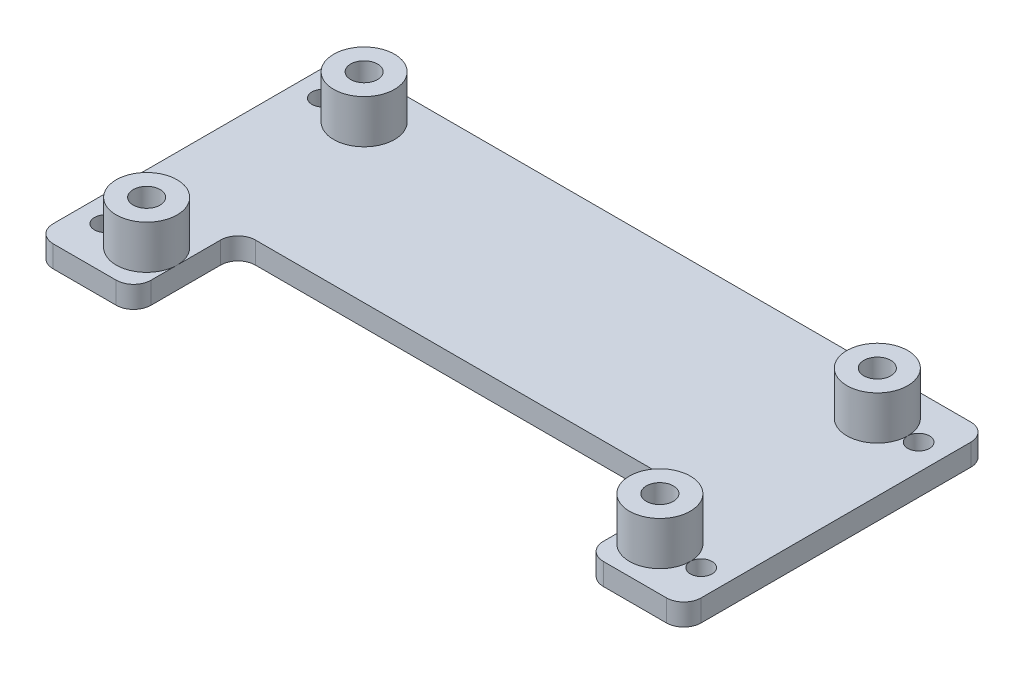
ISO-10303-21;
HEADER;
FILE_DESCRIPTION(('STEP AP214'),'2;1');
FILE_NAME('part.step','',(''),(''),'','','');
FILE_SCHEMA(('AUTOMOTIVE_DESIGN { 1 0 10303 214 1 1 1 1 }'));
ENDSEC;
DATA;
#1=APPLICATION_CONTEXT('core data for automotive mechanical design processes');
#2=APPLICATION_PROTOCOL_DEFINITION('international standard','automotive_design',2000,#1);
#3=PRODUCT_CONTEXT('',#1,'mechanical');
#4=PRODUCT('Part','Part','',(#3));
#5=PRODUCT_RELATED_PRODUCT_CATEGORY('part','',(#4));
#6=PRODUCT_DEFINITION_FORMATION('','',#4);
#7=PRODUCT_DEFINITION_CONTEXT('part definition',#1,'design');
#8=PRODUCT_DEFINITION('design','',#6,#7);
#9=PRODUCT_DEFINITION_SHAPE('','',#8);
#10=(LENGTH_UNIT() NAMED_UNIT(*) SI_UNIT(.MILLI.,.METRE.));
#11=(NAMED_UNIT(*) PLANE_ANGLE_UNIT() SI_UNIT($,.RADIAN.));
#12=(NAMED_UNIT(*) SI_UNIT($,.STERADIAN.) SOLID_ANGLE_UNIT());
#13=UNCERTAINTY_MEASURE_WITH_UNIT(LENGTH_MEASURE(1.E-05),#10,'distance_accuracy_value','');
#14=(GEOMETRIC_REPRESENTATION_CONTEXT(3) GLOBAL_UNCERTAINTY_ASSIGNED_CONTEXT((#13)) GLOBAL_UNIT_ASSIGNED_CONTEXT((#10,
#11,#12)) REPRESENTATION_CONTEXT('',''));
#15=CARTESIAN_POINT('',(0.,0.,0.));
#16=DIRECTION('',(0.,0.,1.));
#17=DIRECTION('',(1.,0.,0.));
#18=AXIS2_PLACEMENT_3D('',#15,#16,#17);
#19=CARTESIAN_POINT('',(0.,3.175,0.));
#20=DIRECTION('',(0.,0.,-1.));
#21=DIRECTION('',(-1.,0.,0.));
#22=AXIS2_PLACEMENT_3D('',#19,#20,#21);
#23=PLANE('',#22);
#24=DIRECTION('',(1.,0.,0.));
#25=VECTOR('',#24,1.);
#26=CARTESIAN_POINT('',(0.,0.,0.));
#27=LINE('',#26,#25);
#28=CARTESIAN_POINT('',(2.54,0.,0.));
#29=VERTEX_POINT('',#28);
#30=CARTESIAN_POINT('',(11.7475,0.,0.));
#31=VERTEX_POINT('',#30);
#32=EDGE_CURVE('E260',#29,#31,#27,.T.);
#33=ORIENTED_EDGE('',*,*,#32,.T.);
#34=DIRECTION('',(0.,1.,0.));
#35=VECTOR('',#34,1.);
#36=CARTESIAN_POINT('',(11.7475,3.175,0.));
#37=LINE('',#36,#35);
#38=CARTESIAN_POINT('',(11.7475,3.175,0.));
#39=VERTEX_POINT('',#38);
#40=EDGE_CURVE('E333',#31,#39,#37,.T.);
#41=ORIENTED_EDGE('',*,*,#40,.T.);
#42=DIRECTION('',(1.,0.,0.));
#43=VECTOR('',#42,1.);
#44=CARTESIAN_POINT('',(0.,3.175,0.));
#45=LINE('',#44,#43);
#46=CARTESIAN_POINT('',(2.54,3.175,0.));
#47=VERTEX_POINT('',#46);
#48=EDGE_CURVE('E248',#47,#39,#45,.T.);
#49=ORIENTED_EDGE('',*,*,#48,.F.);
#50=DIRECTION('',(0.,-1.,0.));
#51=VECTOR('',#50,1.);
#52=CARTESIAN_POINT('',(2.54,0.,0.));
#53=LINE('',#52,#51);
#54=EDGE_CURVE('E314',#47,#29,#53,.T.);
#55=ORIENTED_EDGE('',*,*,#54,.T.);
#56=EDGE_LOOP('',(#33,#41,#49,#55));
#57=FACE_BOUND('',#56,.T.);
#58=ADVANCED_FACE('F41',(#57),#23,.F.);
#59=CARTESIAN_POINT('',(0.,3.175,-44.45));
#60=DIRECTION('',(0.,0.,-1.));
#61=DIRECTION('',(-1.,0.,0.));
#62=AXIS2_PLACEMENT_3D('',#59,#60,#61);
#63=PLANE('',#62);
#64=DIRECTION('',(1.,0.,0.));
#65=VECTOR('',#64,1.);
#66=CARTESIAN_POINT('',(0.,3.175,-44.45));
#67=LINE('',#66,#65);
#68=CARTESIAN_POINT('',(2.54,3.175,-44.45));
#69=VERTEX_POINT('',#68);
#70=CARTESIAN_POINT('',(92.075,3.175,-44.45));
#71=VERTEX_POINT('',#70);
#72=EDGE_CURVE('E240',#69,#71,#67,.T.);
#73=ORIENTED_EDGE('',*,*,#72,.T.);
#74=DIRECTION('',(0.,-1.,0.));
#75=VECTOR('',#74,1.);
#76=CARTESIAN_POINT('',(92.075,0.,-44.45));
#77=LINE('',#76,#75);
#78=CARTESIAN_POINT('',(92.075,0.,-44.45));
#79=VERTEX_POINT('',#78);
#80=EDGE_CURVE('E289',#71,#79,#77,.T.);
#81=ORIENTED_EDGE('',*,*,#80,.T.);
#82=DIRECTION('',(1.,0.,0.));
#83=VECTOR('',#82,1.);
#84=CARTESIAN_POINT('',(0.,0.,-44.45));
#85=LINE('',#84,#83);
#86=CARTESIAN_POINT('',(2.54,0.,-44.45));
#87=VERTEX_POINT('',#86);
#88=EDGE_CURVE('E237',#87,#79,#85,.T.);
#89=ORIENTED_EDGE('',*,*,#88,.F.);
#90=DIRECTION('',(0.,-1.,0.));
#91=VECTOR('',#90,1.);
#92=CARTESIAN_POINT('',(2.54,3.175,-44.45));
#93=LINE('',#92,#91);
#94=EDGE_CURVE('E276',#87,#69,#93,.F.);
#95=ORIENTED_EDGE('',*,*,#94,.T.);
#96=EDGE_LOOP('',(#73,#81,#89,#95));
#97=FACE_BOUND('',#96,.T.);
#98=ADVANCED_FACE('F404',(#97),#63,.T.);
#99=CARTESIAN_POINT('',(0.,3.175,0.));
#100=DIRECTION('',(-1.,0.,0.));
#101=DIRECTION('',(0.,0.,1.));
#102=AXIS2_PLACEMENT_3D('',#99,#100,#101);
#103=PLANE('',#102);
#104=DIRECTION('',(0.,0.,-1.));
#105=VECTOR('',#104,1.);
#106=CARTESIAN_POINT('',(0.,3.175,0.));
#107=LINE('',#106,#105);
#108=CARTESIAN_POINT('',(0.,3.175,-2.54));
#109=VERTEX_POINT('',#108);
#110=CARTESIAN_POINT('',(0.,3.175,-41.91));
#111=VERTEX_POINT('',#110);
#112=EDGE_CURVE('E250',#109,#111,#107,.T.);
#113=ORIENTED_EDGE('',*,*,#112,.T.);
#114=DIRECTION('',(0.,-1.,0.));
#115=VECTOR('',#114,1.);
#116=CARTESIAN_POINT('',(0.,3.175,-41.91));
#117=LINE('',#116,#115);
#118=CARTESIAN_POINT('',(0.,0.,-41.91));
#119=VERTEX_POINT('',#118);
#120=EDGE_CURVE('E322',#111,#119,#117,.T.);
#121=ORIENTED_EDGE('',*,*,#120,.T.);
#122=DIRECTION('',(0.,0.,-1.));
#123=VECTOR('',#122,1.);
#124=CARTESIAN_POINT('',(0.,0.,0.));
#125=LINE('',#124,#123);
#126=CARTESIAN_POINT('',(0.,0.,-2.54));
#127=VERTEX_POINT('',#126);
#128=EDGE_CURVE('E244',#127,#119,#125,.T.);
#129=ORIENTED_EDGE('',*,*,#128,.F.);
#130=DIRECTION('',(0.,-1.,0.));
#131=VECTOR('',#130,1.);
#132=CARTESIAN_POINT('',(0.,3.175,-2.54));
#133=LINE('',#132,#131);
#134=EDGE_CURVE('E320',#127,#109,#133,.F.);
#135=ORIENTED_EDGE('',*,*,#134,.T.);
#136=EDGE_LOOP('',(#113,#121,#129,#135));
#137=FACE_BOUND('',#136,.T.);
#138=ADVANCED_FACE('F395',(#137),#103,.T.);
#139=CARTESIAN_POINT('',(82.8675,3.175,0.));
#140=VERTEX_POINT('',#139);
#141=CARTESIAN_POINT('',(92.075,3.175,0.));
#142=VERTEX_POINT('',#141);
#143=EDGE_CURVE('E247',#140,#142,#45,.T.);
#144=ORIENTED_EDGE('',*,*,#143,.F.);
#145=DIRECTION('',(0.,1.,0.));
#146=VECTOR('',#145,1.);
#147=CARTESIAN_POINT('',(82.8675,3.175,0.));
#148=LINE('',#147,#146);
#149=CARTESIAN_POINT('',(82.8675,0.,0.));
#150=VERTEX_POINT('',#149);
#151=EDGE_CURVE('E354',#140,#150,#148,.F.);
#152=ORIENTED_EDGE('',*,*,#151,.T.);
#153=CARTESIAN_POINT('',(92.075,0.,0.));
#154=VERTEX_POINT('',#153);
#155=EDGE_CURVE('E259',#150,#154,#27,.T.);
#156=ORIENTED_EDGE('',*,*,#155,.T.);
#157=DIRECTION('',(0.,-1.,0.));
#158=VECTOR('',#157,1.);
#159=CARTESIAN_POINT('',(92.075,3.175,0.));
#160=LINE('',#159,#158);
#161=EDGE_CURVE('E317',#154,#142,#160,.F.);
#162=ORIENTED_EDGE('',*,*,#161,.T.);
#163=EDGE_LOOP('',(#144,#152,#156,#162));
#164=FACE_BOUND('',#163,.T.);
#165=ADVANCED_FACE('F461',(#164),#23,.F.);
#166=CARTESIAN_POINT('',(94.615,3.175,0.));
#167=DIRECTION('',(-1.,0.,0.));
#168=DIRECTION('',(0.,0.,1.));
#169=AXIS2_PLACEMENT_3D('',#166,#167,#168);
#170=PLANE('',#169);
#171=DIRECTION('',(0.,0.,-1.));
#172=VECTOR('',#171,1.);
#173=CARTESIAN_POINT('',(94.615,0.,0.));
#174=LINE('',#173,#172);
#175=CARTESIAN_POINT('',(94.615,0.,-2.54));
#176=VERTEX_POINT('',#175);
#177=CARTESIAN_POINT('',(94.615,0.,-41.91));
#178=VERTEX_POINT('',#177);
#179=EDGE_CURVE('E256',#176,#178,#174,.T.);
#180=ORIENTED_EDGE('',*,*,#179,.T.);
#181=DIRECTION('',(0.,-1.,0.));
#182=VECTOR('',#181,1.);
#183=CARTESIAN_POINT('',(94.615,3.175,-41.91));
#184=LINE('',#183,#182);
#185=CARTESIAN_POINT('',(94.615,3.175,-41.91));
#186=VERTEX_POINT('',#185);
#187=EDGE_CURVE('E304',#178,#186,#184,.F.);
#188=ORIENTED_EDGE('',*,*,#187,.T.);
#189=DIRECTION('',(0.,0.,-1.));
#190=VECTOR('',#189,1.);
#191=CARTESIAN_POINT('',(94.615,3.175,0.));
#192=LINE('',#191,#190);
#193=CARTESIAN_POINT('',(94.615,3.175,-2.54));
#194=VERTEX_POINT('',#193);
#195=EDGE_CURVE('E243',#194,#186,#192,.T.);
#196=ORIENTED_EDGE('',*,*,#195,.F.);
#197=DIRECTION('',(0.,-1.,0.));
#198=VECTOR('',#197,1.);
#199=CARTESIAN_POINT('',(94.615,3.175,-2.54));
#200=LINE('',#199,#198);
#201=EDGE_CURVE('E301',#194,#176,#200,.T.);
#202=ORIENTED_EDGE('',*,*,#201,.T.);
#203=EDGE_LOOP('',(#180,#188,#196,#202));
#204=FACE_BOUND('',#203,.T.);
#205=ADVANCED_FACE('F413',(#204),#170,.F.);
#206=CARTESIAN_POINT('',(0.,3.175,0.));
#207=DIRECTION('',(0.,1.,0.));
#208=DIRECTION('',(0.,0.,1.));
#209=AXIS2_PLACEMENT_3D('',#206,#207,#208);
#210=PLANE('',#209);
#211=ORIENTED_EDGE('',*,*,#48,.T.);
#212=CARTESIAN_POINT('',(11.7475,3.175,-2.54));
#213=DIRECTION('',(0.,1.,0.));
#214=DIRECTION('',(0.,0.,1.));
#215=AXIS2_PLACEMENT_3D('',#212,#213,#214);
#216=CIRCLE('',#215,2.54);
#217=CARTESIAN_POINT('',(14.2875,3.175,-2.54));
#218=VERTEX_POINT('',#217);
#219=EDGE_CURVE('E193',#39,#218,#216,.T.);
#220=ORIENTED_EDGE('',*,*,#219,.T.);
#221=DIRECTION('',(0.,0.,1.));
#222=VECTOR('',#221,1.);
#223=CARTESIAN_POINT('',(14.2875,3.175,0.));
#224=LINE('',#223,#222);
#225=CARTESIAN_POINT('',(14.2875,3.175,-6.34999999999999));
#226=VERTEX_POINT('',#225);
#227=EDGE_CURVE('E177',#226,#218,#224,.T.);
#228=ORIENTED_EDGE('',*,*,#227,.F.);
#229=CARTESIAN_POINT('',(9.8425,3.175,-6.34999999999999));
#230=DIRECTION('',(0.,1.,0.));
#231=DIRECTION('',(0.,0.,1.));
#232=AXIS2_PLACEMENT_3D('',#229,#230,#231);
#233=CIRCLE('',#232,4.445);
#234=CARTESIAN_POINT('',(5.3975,3.175,-6.34999999999999));
#235=VERTEX_POINT('',#234);
#236=EDGE_CURVE('E192',#235,#226,#233,.T.);
#237=ORIENTED_EDGE('',*,*,#236,.F.);
#238=CARTESIAN_POINT('',(3.81,3.175,-6.34999999999999));
#239=DIRECTION('',(0.,1.,0.));
#240=DIRECTION('',(0.,0.,1.));
#241=AXIS2_PLACEMENT_3D('',#238,#239,#240);
#242=CIRCLE('',#241,1.5875);
#243=EDGE_CURVE('E196',#235,#235,#242,.T.);
#244=ORIENTED_EDGE('',*,*,#243,.F.);
#245=EDGE_CURVE('E194',#226,#235,#233,.T.);
#246=ORIENTED_EDGE('',*,*,#245,.F.);
#247=CARTESIAN_POINT('',(14.2875,3.175,-12.7));
#248=VERTEX_POINT('',#247);
#249=EDGE_CURVE('E174',#248,#226,#224,.T.);
#250=ORIENTED_EDGE('',*,*,#249,.F.);
#251=CARTESIAN_POINT('',(16.8275,3.175,-12.7));
#252=DIRECTION('',(0.,1.,0.));
#253=DIRECTION('',(0.,0.,1.));
#254=AXIS2_PLACEMENT_3D('',#251,#252,#253);
#255=CIRCLE('',#254,2.54);
#256=CARTESIAN_POINT('',(16.8275,3.175,-15.24));
#257=VERTEX_POINT('',#256);
#258=EDGE_CURVE('E356',#248,#257,#255,.F.);
#259=ORIENTED_EDGE('',*,*,#258,.T.);
#260=DIRECTION('',(-1.,0.,0.));
#261=VECTOR('',#260,1.);
#262=CARTESIAN_POINT('',(14.2875,3.175,-15.24));
#263=LINE('',#262,#261);
#264=CARTESIAN_POINT('',(77.7875,3.175,-15.24));
#265=VERTEX_POINT('',#264);
#266=EDGE_CURVE('E364',#265,#257,#263,.T.);
#267=ORIENTED_EDGE('',*,*,#266,.F.);
#268=CARTESIAN_POINT('',(77.7875,3.175,-12.7));
#269=DIRECTION('',(0.,1.,0.));
#270=DIRECTION('',(0.,0.,1.));
#271=AXIS2_PLACEMENT_3D('',#268,#269,#270);
#272=CIRCLE('',#271,2.54);
#273=CARTESIAN_POINT('',(80.3275,3.175,-12.7));
#274=VERTEX_POINT('',#273);
#275=EDGE_CURVE('E49',#265,#274,#272,.F.);
#276=ORIENTED_EDGE('',*,*,#275,.T.);
#277=DIRECTION('',(0.,0.,-1.));
#278=VECTOR('',#277,1.);
#279=CARTESIAN_POINT('',(80.3275,3.175,0.));
#280=LINE('',#279,#278);
#281=CARTESIAN_POINT('',(80.3275,3.175,-6.34999999999999));
#282=VERTEX_POINT('',#281);
#283=EDGE_CURVE('E184',#282,#274,#280,.T.);
#284=ORIENTED_EDGE('',*,*,#283,.F.);
#285=CARTESIAN_POINT('',(84.7725,3.175,-6.34999999999999));
#286=DIRECTION('',(0.,1.,0.));
#287=DIRECTION('',(0.,0.,1.));
#288=AXIS2_PLACEMENT_3D('',#285,#286,#287);
#289=CIRCLE('',#288,4.445);
#290=CARTESIAN_POINT('',(89.2175,3.175,-6.34999999999999));
#291=VERTEX_POINT('',#290);
#292=EDGE_CURVE('E212',#291,#282,#289,.T.);
#293=ORIENTED_EDGE('',*,*,#292,.F.);
#294=CARTESIAN_POINT('',(90.805,3.175,-6.34999999999999));
#295=DIRECTION('',(0.,1.,0.));
#296=DIRECTION('',(0.,0.,1.));
#297=AXIS2_PLACEMENT_3D('',#294,#295,#296);
#298=CIRCLE('',#297,1.5875);
#299=EDGE_CURVE('E426',#291,#291,#298,.T.);
#300=ORIENTED_EDGE('',*,*,#299,.F.);
#301=EDGE_CURVE('E216',#282,#291,#289,.T.);
#302=ORIENTED_EDGE('',*,*,#301,.F.);
#303=CARTESIAN_POINT('',(80.3275,3.175,-2.54));
#304=VERTEX_POINT('',#303);
#305=EDGE_CURVE('E369',#304,#282,#280,.T.);
#306=ORIENTED_EDGE('',*,*,#305,.F.);
#307=CARTESIAN_POINT('',(82.8675,3.175,-2.54));
#308=DIRECTION('',(0.,1.,0.));
#309=DIRECTION('',(0.,0.,1.));
#310=AXIS2_PLACEMENT_3D('',#307,#308,#309);
#311=CIRCLE('',#310,2.54);
#312=EDGE_CURVE('E336',#304,#140,#311,.T.);
#313=ORIENTED_EDGE('',*,*,#312,.T.);
#314=ORIENTED_EDGE('',*,*,#143,.T.);
#315=CARTESIAN_POINT('',(92.075,3.175,-2.54));
#316=DIRECTION('',(0.,1.,0.));
#317=DIRECTION('',(0.,0.,1.));
#318=AXIS2_PLACEMENT_3D('',#315,#316,#317);
#319=CIRCLE('',#318,2.54);
#320=EDGE_CURVE('E310',#142,#194,#319,.T.);
#321=ORIENTED_EDGE('',*,*,#320,.T.);
#322=ORIENTED_EDGE('',*,*,#195,.T.);
#323=CARTESIAN_POINT('',(92.075,3.175,-41.91));
#324=DIRECTION('',(0.,1.,0.));
#325=DIRECTION('',(0.,0.,1.));
#326=AXIS2_PLACEMENT_3D('',#323,#324,#325);
#327=CIRCLE('',#326,2.54);
#328=EDGE_CURVE('E312',#186,#71,#327,.T.);
#329=ORIENTED_EDGE('',*,*,#328,.T.);
#330=ORIENTED_EDGE('',*,*,#72,.F.);
#331=CARTESIAN_POINT('',(2.54,3.175,-41.91));
#332=DIRECTION('',(0.,1.,0.));
#333=DIRECTION('',(0.,0.,1.));
#334=AXIS2_PLACEMENT_3D('',#331,#332,#333);
#335=CIRCLE('',#334,2.54);
#336=EDGE_CURVE('E308',#69,#111,#335,.T.);
#337=ORIENTED_EDGE('',*,*,#336,.T.);
#338=ORIENTED_EDGE('',*,*,#112,.F.);
#339=CARTESIAN_POINT('',(2.54,3.175,-2.54));
#340=DIRECTION('',(0.,1.,0.));
#341=DIRECTION('',(0.,0.,1.));
#342=AXIS2_PLACEMENT_3D('',#339,#340,#341);
#343=CIRCLE('',#342,2.54);
#344=EDGE_CURVE('E306',#109,#47,#343,.T.);
#345=ORIENTED_EDGE('',*,*,#344,.T.);
#346=EDGE_LOOP('',(#211,#220,#228,#237,#244,#246,#250,#259,#267,#276,#284,#293,#300,#302,#306,
#313,#314,#321,#322,#329,#330,#337,#338,#345));
#347=FACE_BOUND('',#346,.T.);
#348=CARTESIAN_POINT('',(84.7725,3.175,-38.1));
#349=DIRECTION('',(0.,1.,0.));
#350=DIRECTION('',(0.,0.,1.));
#351=AXIS2_PLACEMENT_3D('',#348,#349,#350);
#352=CIRCLE('',#351,4.445);
#353=CARTESIAN_POINT('',(89.2175,3.175,-38.1));
#354=VERTEX_POINT('',#353);
#355=EDGE_CURVE('E222',#354,#354,#352,.T.);
#356=ORIENTED_EDGE('',*,*,#355,.F.);
#357=CARTESIAN_POINT('',(90.805,3.175,-38.1));
#358=DIRECTION('',(0.,1.,0.));
#359=DIRECTION('',(0.,0.,1.));
#360=AXIS2_PLACEMENT_3D('',#357,#358,#359);
#361=CIRCLE('',#360,1.58749999999999);
#362=EDGE_CURVE('E431',#354,#354,#361,.T.);
#363=ORIENTED_EDGE('',*,*,#362,.F.);
#364=EDGE_LOOP('',(#356,#363));
#365=FACE_BOUND('',#364,.T.);
#366=CARTESIAN_POINT('',(9.8425,3.175,-38.1));
#367=DIRECTION('',(0.,1.,0.));
#368=DIRECTION('',(0.,0.,1.));
#369=AXIS2_PLACEMENT_3D('',#366,#367,#368);
#370=CIRCLE('',#369,4.445);
#371=CARTESIAN_POINT('',(5.3975,3.175,-38.1));
#372=VERTEX_POINT('',#371);
#373=EDGE_CURVE('E233',#372,#372,#370,.T.);
#374=ORIENTED_EDGE('',*,*,#373,.F.);
#375=CARTESIAN_POINT('',(3.81,3.175,-38.1));
#376=DIRECTION('',(0.,1.,0.));
#377=DIRECTION('',(0.,0.,1.));
#378=AXIS2_PLACEMENT_3D('',#375,#376,#377);
#379=CIRCLE('',#378,1.5875);
#380=EDGE_CURVE('E207',#372,#372,#379,.T.);
#381=ORIENTED_EDGE('',*,*,#380,.F.);
#382=EDGE_LOOP('',(#374,#381));
#383=FACE_BOUND('',#382,.T.);
#384=ADVANCED_FACE('F188',(#347,#365,#383),#210,.T.);
#385=CARTESIAN_POINT('',(0.,0.,0.));
#386=DIRECTION('',(0.,1.,0.));
#387=DIRECTION('',(0.,0.,1.));
#388=AXIS2_PLACEMENT_3D('',#385,#386,#387);
#389=PLANE('',#388);
#390=CARTESIAN_POINT('',(3.81,0.,-6.34999999999999));
#391=DIRECTION('',(0.,1.,0.));
#392=DIRECTION('',(0.,0.,1.));
#393=AXIS2_PLACEMENT_3D('',#390,#391,#392);
#394=CIRCLE('',#393,1.5875);
#395=CARTESIAN_POINT('',(3.81,0.,-4.76249999999999));
#396=VERTEX_POINT('',#395);
#397=EDGE_CURVE('E210',#396,#396,#394,.T.);
#398=ORIENTED_EDGE('',*,*,#397,.T.);
#399=EDGE_LOOP('',(#398));
#400=FACE_BOUND('',#399,.T.);
#401=CARTESIAN_POINT('',(90.805,0.,-38.1));
#402=DIRECTION('',(0.,1.,0.));
#403=DIRECTION('',(0.,0.,1.));
#404=AXIS2_PLACEMENT_3D('',#401,#402,#403);
#405=CIRCLE('',#404,1.58749999999999);
#406=CARTESIAN_POINT('',(90.805,0.,-36.5125));
#407=VERTEX_POINT('',#406);
#408=EDGE_CURVE('E283',#407,#407,#405,.T.);
#409=ORIENTED_EDGE('',*,*,#408,.T.);
#410=EDGE_LOOP('',(#409));
#411=FACE_BOUND('',#410,.T.);
#412=CARTESIAN_POINT('',(90.805,0.,-6.34999999999999));
#413=DIRECTION('',(0.,1.,0.));
#414=DIRECTION('',(0.,0.,1.));
#415=AXIS2_PLACEMENT_3D('',#412,#413,#414);
#416=CIRCLE('',#415,1.5875);
#417=CARTESIAN_POINT('',(90.805,0.,-4.76249999999999));
#418=VERTEX_POINT('',#417);
#419=EDGE_CURVE('E280',#418,#418,#416,.T.);
#420=ORIENTED_EDGE('',*,*,#419,.T.);
#421=EDGE_LOOP('',(#420));
#422=FACE_BOUND('',#421,.T.);
#423=CARTESIAN_POINT('',(3.81,0.,-38.1));
#424=DIRECTION('',(0.,1.,0.));
#425=DIRECTION('',(0.,0.,1.));
#426=AXIS2_PLACEMENT_3D('',#423,#424,#425);
#427=CIRCLE('',#426,1.5875);
#428=CARTESIAN_POINT('',(3.81,0.,-36.5125));
#429=VERTEX_POINT('',#428);
#430=EDGE_CURVE('E277',#429,#429,#427,.T.);
#431=ORIENTED_EDGE('',*,*,#430,.T.);
#432=EDGE_LOOP('',(#431));
#433=FACE_BOUND('',#432,.T.);
#434=DIRECTION('',(0.,0.,1.));
#435=VECTOR('',#434,1.);
#436=CARTESIAN_POINT('',(14.2875,0.,0.));
#437=LINE('',#436,#435);
#438=CARTESIAN_POINT('',(14.2875,0.,-12.7));
#439=VERTEX_POINT('',#438);
#440=CARTESIAN_POINT('',(14.2875,0.,-2.54));
#441=VERTEX_POINT('',#440);
#442=EDGE_CURVE('E330',#439,#441,#437,.T.);
#443=ORIENTED_EDGE('',*,*,#442,.T.);
#444=CARTESIAN_POINT('',(11.7475,0.,-2.54));
#445=DIRECTION('',(0.,1.,0.));
#446=DIRECTION('',(0.,0.,1.));
#447=AXIS2_PLACEMENT_3D('',#444,#445,#446);
#448=CIRCLE('',#447,2.54);
#449=EDGE_CURVE('E343',#441,#31,#448,.F.);
#450=ORIENTED_EDGE('',*,*,#449,.T.);
#451=ORIENTED_EDGE('',*,*,#32,.F.);
#452=CARTESIAN_POINT('',(2.54,0.,-2.54));
#453=DIRECTION('',(0.,1.,0.));
#454=DIRECTION('',(0.,0.,1.));
#455=AXIS2_PLACEMENT_3D('',#452,#453,#454);
#456=CIRCLE('',#455,2.54);
#457=EDGE_CURVE('E292',#29,#127,#456,.F.);
#458=ORIENTED_EDGE('',*,*,#457,.T.);
#459=ORIENTED_EDGE('',*,*,#128,.T.);
#460=CARTESIAN_POINT('',(2.54,0.,-41.91));
#461=DIRECTION('',(0.,1.,0.));
#462=DIRECTION('',(0.,0.,1.));
#463=AXIS2_PLACEMENT_3D('',#460,#461,#462);
#464=CIRCLE('',#463,2.54);
#465=EDGE_CURVE('E294',#119,#87,#464,.F.);
#466=ORIENTED_EDGE('',*,*,#465,.T.);
#467=ORIENTED_EDGE('',*,*,#88,.T.);
#468=CARTESIAN_POINT('',(92.075,0.,-41.91));
#469=DIRECTION('',(0.,1.,0.));
#470=DIRECTION('',(0.,0.,1.));
#471=AXIS2_PLACEMENT_3D('',#468,#469,#470);
#472=CIRCLE('',#471,2.54);
#473=EDGE_CURVE('E299',#79,#178,#472,.F.);
#474=ORIENTED_EDGE('',*,*,#473,.T.);
#475=ORIENTED_EDGE('',*,*,#179,.F.);
#476=CARTESIAN_POINT('',(92.075,0.,-2.54));
#477=DIRECTION('',(0.,1.,0.));
#478=DIRECTION('',(0.,0.,1.));
#479=AXIS2_PLACEMENT_3D('',#476,#477,#478);
#480=CIRCLE('',#479,2.54);
#481=EDGE_CURVE('E296',#176,#154,#480,.F.);
#482=ORIENTED_EDGE('',*,*,#481,.T.);
#483=ORIENTED_EDGE('',*,*,#155,.F.);
#484=CARTESIAN_POINT('',(82.8675,0.,-2.54));
#485=DIRECTION('',(0.,1.,0.));
#486=DIRECTION('',(0.,0.,1.));
#487=AXIS2_PLACEMENT_3D('',#484,#485,#486);
#488=CIRCLE('',#487,2.54);
#489=CARTESIAN_POINT('',(80.3275,0.,-2.54));
#490=VERTEX_POINT('',#489);
#491=EDGE_CURVE('E63',#150,#490,#488,.F.);
#492=ORIENTED_EDGE('',*,*,#491,.T.);
#493=DIRECTION('',(0.,0.,-1.));
#494=VECTOR('',#493,1.);
#495=CARTESIAN_POINT('',(80.3275,0.,0.));
#496=LINE('',#495,#494);
#497=CARTESIAN_POINT('',(80.3275,0.,-12.7));
#498=VERTEX_POINT('',#497);
#499=EDGE_CURVE('E325',#490,#498,#496,.T.);
#500=ORIENTED_EDGE('',*,*,#499,.T.);
#501=CARTESIAN_POINT('',(77.7875,0.,-12.7));
#502=DIRECTION('',(0.,1.,0.));
#503=DIRECTION('',(0.,0.,1.));
#504=AXIS2_PLACEMENT_3D('',#501,#502,#503);
#505=CIRCLE('',#504,2.54);
#506=CARTESIAN_POINT('',(77.7875,0.,-15.24));
#507=VERTEX_POINT('',#506);
#508=EDGE_CURVE('E11',#498,#507,#505,.T.);
#509=ORIENTED_EDGE('',*,*,#508,.T.);
#510=DIRECTION('',(-1.,0.,0.));
#511=VECTOR('',#510,1.);
#512=CARTESIAN_POINT('',(0.,0.,-15.24));
#513=LINE('',#512,#511);
#514=CARTESIAN_POINT('',(16.8275,0.,-15.24));
#515=VERTEX_POINT('',#514);
#516=EDGE_CURVE('E327',#507,#515,#513,.T.);
#517=ORIENTED_EDGE('',*,*,#516,.T.);
#518=CARTESIAN_POINT('',(16.8275,0.,-12.7));
#519=DIRECTION('',(0.,1.,0.));
#520=DIRECTION('',(0.,0.,1.));
#521=AXIS2_PLACEMENT_3D('',#518,#519,#520);
#522=CIRCLE('',#521,2.54);
#523=EDGE_CURVE('E358',#515,#439,#522,.T.);
#524=ORIENTED_EDGE('',*,*,#523,.T.);
#525=EDGE_LOOP('',(#443,#450,#451,#458,#459,#466,#467,#474,#475,#482,#483,#492,#500,#509,#517,#524));
#526=FACE_BOUND('',#525,.T.);
#527=ADVANCED_FACE('F374',(#400,#411,#422,#433,#526),#389,.F.);
#528=CARTESIAN_POINT('',(9.8425,9.525,-38.1));
#529=DIRECTION('',(0.,1.,0.));
#530=DIRECTION('',(0.,0.,1.));
#531=AXIS2_PLACEMENT_3D('',#528,#529,#530);
#532=PLANE('',#531);
#533=CARTESIAN_POINT('',(9.8425,9.525,-38.1));
#534=DIRECTION('',(0.,1.,0.));
#535=DIRECTION('',(0.,0.,1.));
#536=AXIS2_PLACEMENT_3D('',#533,#534,#535);
#537=CIRCLE('',#536,4.445);
#538=CARTESIAN_POINT('',(9.8425,9.525,-33.655));
#539=VERTEX_POINT('',#538);
#540=EDGE_CURVE('E234',#539,#539,#537,.T.);
#541=ORIENTED_EDGE('',*,*,#540,.T.);
#542=EDGE_LOOP('',(#541));
#543=FACE_BOUND('',#542,.T.);
#544=CARTESIAN_POINT('',(9.8425,9.525,-38.1));
#545=DIRECTION('',(0.,1.,0.));
#546=DIRECTION('',(0.,0.,1.));
#547=AXIS2_PLACEMENT_3D('',#544,#545,#546);
#548=CIRCLE('',#547,1.9685);
#549=CARTESIAN_POINT('',(9.8425,9.525,-36.1315));
#550=VERTEX_POINT('',#549);
#551=EDGE_CURVE('E230',#550,#550,#548,.T.);
#552=ORIENTED_EDGE('',*,*,#551,.F.);
#553=EDGE_LOOP('',(#552));
#554=FACE_BOUND('',#553,.T.);
#555=ADVANCED_FACE('F480',(#543,#554),#532,.T.);
#556=CARTESIAN_POINT('',(9.8425,9.525,-38.1));
#557=DIRECTION('',(0.,-1.,0.));
#558=DIRECTION('',(0.,0.,-1.));
#559=AXIS2_PLACEMENT_3D('',#556,#557,#558);
#560=CYLINDRICAL_SURFACE('',#559,4.445);
#561=ORIENTED_EDGE('',*,*,#540,.F.);
#562=EDGE_LOOP('',(#561));
#563=FACE_BOUND('',#562,.T.);
#564=ORIENTED_EDGE('',*,*,#373,.T.);
#565=EDGE_LOOP('',(#564));
#566=FACE_BOUND('',#565,.T.);
#567=ADVANCED_FACE('F484',(#563,#566),#560,.T.);
#568=CARTESIAN_POINT('',(9.8425,9.525,-38.1));
#569=DIRECTION('',(0.,-1.,0.));
#570=DIRECTION('',(0.,0.,-1.));
#571=AXIS2_PLACEMENT_3D('',#568,#569,#570);
#572=CYLINDRICAL_SURFACE('',#571,1.9685);
#573=ORIENTED_EDGE('',*,*,#551,.T.);
#574=EDGE_LOOP('',(#573));
#575=FACE_BOUND('',#574,.T.);
#576=CARTESIAN_POINT('',(9.8425,3.175,-38.1));
#577=DIRECTION('',(0.,1.,0.));
#578=DIRECTION('',(0.,0.,1.));
#579=AXIS2_PLACEMENT_3D('',#576,#577,#578);
#580=CIRCLE('',#579,1.9685);
#581=CARTESIAN_POINT('',(9.8425,3.175,-36.1315));
#582=VERTEX_POINT('',#581);
#583=EDGE_CURVE('E253',#582,#582,#580,.F.);
#584=ORIENTED_EDGE('',*,*,#583,.T.);
#585=EDGE_LOOP('',(#584));
#586=FACE_BOUND('',#585,.T.);
#587=ADVANCED_FACE('F486',(#575,#586),#572,.F.);
#588=ORIENTED_EDGE('',*,*,#583,.F.);
#589=EDGE_LOOP('',(#588));
#590=FACE_BOUND('',#589,.T.);
#591=ADVANCED_FACE('F454',(#590),#210,.T.);
#592=CARTESIAN_POINT('',(84.7725,9.525,-38.1));
#593=DIRECTION('',(0.,1.,0.));
#594=DIRECTION('',(0.,0.,1.));
#595=AXIS2_PLACEMENT_3D('',#592,#593,#594);
#596=PLANE('',#595);
#597=CARTESIAN_POINT('',(84.7725,9.525,-38.1));
#598=DIRECTION('',(0.,1.,0.));
#599=DIRECTION('',(0.,0.,1.));
#600=AXIS2_PLACEMENT_3D('',#597,#598,#599);
#601=CIRCLE('',#600,4.445);
#602=CARTESIAN_POINT('',(84.7725,9.525,-33.655));
#603=VERTEX_POINT('',#602);
#604=EDGE_CURVE('E221',#603,#603,#601,.T.);
#605=ORIENTED_EDGE('',*,*,#604,.T.);
#606=EDGE_LOOP('',(#605));
#607=FACE_BOUND('',#606,.T.);
#608=CARTESIAN_POINT('',(84.7725,9.525,-38.1));
#609=DIRECTION('',(0.,1.,0.));
#610=DIRECTION('',(0.,0.,1.));
#611=AXIS2_PLACEMENT_3D('',#608,#609,#610);
#612=CIRCLE('',#611,1.9685);
#613=CARTESIAN_POINT('',(84.7725,9.525,-36.1315));
#614=VERTEX_POINT('',#613);
#615=EDGE_CURVE('E225',#614,#614,#612,.T.);
#616=ORIENTED_EDGE('',*,*,#615,.F.);
#617=EDGE_LOOP('',(#616));
#618=FACE_BOUND('',#617,.T.);
#619=ADVANCED_FACE('F442',(#607,#618),#596,.T.);
#620=CARTESIAN_POINT('',(84.7725,9.525,-38.1));
#621=DIRECTION('',(0.,-1.,0.));
#622=DIRECTION('',(0.,0.,-1.));
#623=AXIS2_PLACEMENT_3D('',#620,#621,#622);
#624=CYLINDRICAL_SURFACE('',#623,4.445);
#625=ORIENTED_EDGE('',*,*,#604,.F.);
#626=EDGE_LOOP('',(#625));
#627=FACE_BOUND('',#626,.T.);
#628=ORIENTED_EDGE('',*,*,#355,.T.);
#629=EDGE_LOOP('',(#628));
#630=FACE_BOUND('',#629,.T.);
#631=ADVANCED_FACE('F439',(#627,#630),#624,.T.);
#632=CARTESIAN_POINT('',(84.7725,9.525,-38.1));
#633=DIRECTION('',(0.,-1.,0.));
#634=DIRECTION('',(0.,0.,-1.));
#635=AXIS2_PLACEMENT_3D('',#632,#633,#634);
#636=CYLINDRICAL_SURFACE('',#635,1.9685);
#637=ORIENTED_EDGE('',*,*,#615,.T.);
#638=EDGE_LOOP('',(#637));
#639=FACE_BOUND('',#638,.T.);
#640=CARTESIAN_POINT('',(84.7725,3.175,-38.1));
#641=DIRECTION('',(0.,1.,0.));
#642=DIRECTION('',(0.,0.,1.));
#643=AXIS2_PLACEMENT_3D('',#640,#641,#642);
#644=CIRCLE('',#643,1.9685);
#645=CARTESIAN_POINT('',(84.7725,3.175,-36.1315));
#646=VERTEX_POINT('',#645);
#647=EDGE_CURVE('E267',#646,#646,#644,.F.);
#648=ORIENTED_EDGE('',*,*,#647,.T.);
#649=EDGE_LOOP('',(#648));
#650=FACE_BOUND('',#649,.T.);
#651=ADVANCED_FACE('F441',(#639,#650),#636,.F.);
#652=ORIENTED_EDGE('',*,*,#647,.F.);
#653=EDGE_LOOP('',(#652));
#654=FACE_BOUND('',#653,.T.);
#655=ADVANCED_FACE('F450',(#654),#210,.T.);
#656=CARTESIAN_POINT('',(84.7725,9.525,-6.34999999999999));
#657=DIRECTION('',(0.,1.,0.));
#658=DIRECTION('',(0.,0.,1.));
#659=AXIS2_PLACEMENT_3D('',#656,#657,#658);
#660=PLANE('',#659);
#661=CARTESIAN_POINT('',(84.7725,9.525,-6.34999999999999));
#662=DIRECTION('',(0.,1.,0.));
#663=DIRECTION('',(0.,0.,1.));
#664=AXIS2_PLACEMENT_3D('',#661,#662,#663);
#665=CIRCLE('',#664,4.445);
#666=CARTESIAN_POINT('',(84.7725,9.525,-1.90499999999999));
#667=VERTEX_POINT('',#666);
#668=EDGE_CURVE('E203',#667,#667,#665,.T.);
#669=ORIENTED_EDGE('',*,*,#668,.T.);
#670=EDGE_LOOP('',(#669));
#671=FACE_BOUND('',#670,.T.);
#672=CARTESIAN_POINT('',(84.7725,9.525,-6.34999999999999));
#673=DIRECTION('',(0.,1.,0.));
#674=DIRECTION('',(0.,0.,1.));
#675=AXIS2_PLACEMENT_3D('',#672,#673,#674);
#676=CIRCLE('',#675,1.9685);
#677=CARTESIAN_POINT('',(84.7725,9.525,-4.38149999999999));
#678=VERTEX_POINT('',#677);
#679=EDGE_CURVE('E215',#678,#678,#676,.T.);
#680=ORIENTED_EDGE('',*,*,#679,.F.);
#681=EDGE_LOOP('',(#680));
#682=FACE_BOUND('',#681,.T.);
#683=ADVANCED_FACE('F504',(#671,#682),#660,.T.);
#684=CARTESIAN_POINT('',(84.7725,9.525,-6.34999999999999));
#685=DIRECTION('',(0.,-1.,0.));
#686=DIRECTION('',(0.,0.,-1.));
#687=AXIS2_PLACEMENT_3D('',#684,#685,#686);
#688=CYLINDRICAL_SURFACE('',#687,4.445);
#689=ORIENTED_EDGE('',*,*,#668,.F.);
#690=EDGE_LOOP('',(#689));
#691=FACE_BOUND('',#690,.T.);
#692=ORIENTED_EDGE('',*,*,#292,.T.);
#693=ORIENTED_EDGE('',*,*,#301,.T.);
#694=EDGE_LOOP('',(#692,#693));
#695=FACE_BOUND('',#694,.T.);
#696=ADVANCED_FACE('F510',(#691,#695),#688,.T.);
#697=CARTESIAN_POINT('',(84.7725,9.525,-6.34999999999999));
#698=DIRECTION('',(0.,-1.,0.));
#699=DIRECTION('',(0.,0.,-1.));
#700=AXIS2_PLACEMENT_3D('',#697,#698,#699);
#701=CYLINDRICAL_SURFACE('',#700,1.9685);
#702=ORIENTED_EDGE('',*,*,#679,.T.);
#703=EDGE_LOOP('',(#702));
#704=FACE_BOUND('',#703,.T.);
#705=CARTESIAN_POINT('',(84.7725,3.175,-6.34999999999999));
#706=DIRECTION('',(0.,1.,0.));
#707=DIRECTION('',(0.,0.,1.));
#708=AXIS2_PLACEMENT_3D('',#705,#706,#707);
#709=CIRCLE('',#708,1.9685);
#710=CARTESIAN_POINT('',(84.7725,3.175,-4.38149999999999));
#711=VERTEX_POINT('',#710);
#712=EDGE_CURVE('E270',#711,#711,#709,.F.);
#713=ORIENTED_EDGE('',*,*,#712,.T.);
#714=EDGE_LOOP('',(#713));
#715=FACE_BOUND('',#714,.T.);
#716=ADVANCED_FACE('F516',(#704,#715),#701,.F.);
#717=ORIENTED_EDGE('',*,*,#712,.F.);
#718=EDGE_LOOP('',(#717));
#719=FACE_BOUND('',#718,.T.);
#720=ADVANCED_FACE('F506',(#719),#210,.T.);
#721=CARTESIAN_POINT('',(9.8425,9.525,-6.34999999999999));
#722=DIRECTION('',(0.,1.,0.));
#723=DIRECTION('',(0.,0.,1.));
#724=AXIS2_PLACEMENT_3D('',#721,#722,#723);
#725=PLANE('',#724);
#726=CARTESIAN_POINT('',(9.8425,9.525,-6.34999999999999));
#727=DIRECTION('',(0.,1.,0.));
#728=DIRECTION('',(0.,0.,1.));
#729=AXIS2_PLACEMENT_3D('',#726,#727,#728);
#730=CIRCLE('',#729,4.445);
#731=CARTESIAN_POINT('',(9.8425,9.525,-1.905));
#732=VERTEX_POINT('',#731);
#733=EDGE_CURVE('E198',#732,#732,#730,.T.);
#734=ORIENTED_EDGE('',*,*,#733,.T.);
#735=EDGE_LOOP('',(#734));
#736=FACE_BOUND('',#735,.T.);
#737=CARTESIAN_POINT('',(9.8425,9.525,-6.34999999999999));
#738=DIRECTION('',(0.,1.,0.));
#739=DIRECTION('',(0.,0.,1.));
#740=AXIS2_PLACEMENT_3D('',#737,#738,#739);
#741=CIRCLE('',#740,1.9685);
#742=CARTESIAN_POINT('',(9.8425,9.525,-4.38149999999999));
#743=VERTEX_POINT('',#742);
#744=EDGE_CURVE('E201',#743,#743,#741,.T.);
#745=ORIENTED_EDGE('',*,*,#744,.F.);
#746=EDGE_LOOP('',(#745));
#747=FACE_BOUND('',#746,.T.);
#748=ADVANCED_FACE('F515',(#736,#747),#725,.T.);
#749=CARTESIAN_POINT('',(9.8425,9.525,-6.34999999999999));
#750=DIRECTION('',(0.,-1.,0.));
#751=DIRECTION('',(0.,0.,-1.));
#752=AXIS2_PLACEMENT_3D('',#749,#750,#751);
#753=CYLINDRICAL_SURFACE('',#752,4.445);
#754=ORIENTED_EDGE('',*,*,#733,.F.);
#755=EDGE_LOOP('',(#754));
#756=FACE_BOUND('',#755,.T.);
#757=ORIENTED_EDGE('',*,*,#236,.T.);
#758=ORIENTED_EDGE('',*,*,#245,.T.);
#759=EDGE_LOOP('',(#757,#758));
#760=FACE_BOUND('',#759,.T.);
#761=ADVANCED_FACE('F200',(#756,#760),#753,.T.);
#762=CARTESIAN_POINT('',(9.8425,9.525,-6.34999999999999));
#763=DIRECTION('',(0.,-1.,0.));
#764=DIRECTION('',(0.,0.,-1.));
#765=AXIS2_PLACEMENT_3D('',#762,#763,#764);
#766=CYLINDRICAL_SURFACE('',#765,1.9685);
#767=ORIENTED_EDGE('',*,*,#744,.T.);
#768=EDGE_LOOP('',(#767));
#769=FACE_BOUND('',#768,.T.);
#770=CARTESIAN_POINT('',(9.8425,3.175,-6.34999999999999));
#771=DIRECTION('',(0.,1.,0.));
#772=DIRECTION('',(0.,0.,1.));
#773=AXIS2_PLACEMENT_3D('',#770,#771,#772);
#774=CIRCLE('',#773,1.9685);
#775=CARTESIAN_POINT('',(9.8425,3.175,-4.38149999999999));
#776=VERTEX_POINT('',#775);
#777=EDGE_CURVE('E273',#776,#776,#774,.F.);
#778=ORIENTED_EDGE('',*,*,#777,.T.);
#779=EDGE_LOOP('',(#778));
#780=FACE_BOUND('',#779,.T.);
#781=ADVANCED_FACE('F528',(#769,#780),#766,.F.);
#782=ORIENTED_EDGE('',*,*,#777,.F.);
#783=EDGE_LOOP('',(#782));
#784=FACE_BOUND('',#783,.T.);
#785=ADVANCED_FACE('F483',(#784),#210,.T.);
#786=CARTESIAN_POINT('',(3.81,-3.175,-38.1));
#787=DIRECTION('',(0.,1.,0.));
#788=DIRECTION('',(0.,0.,1.));
#789=AXIS2_PLACEMENT_3D('',#786,#787,#788);
#790=CYLINDRICAL_SURFACE('',#789,1.5875);
#791=ORIENTED_EDGE('',*,*,#380,.T.);
#792=EDGE_LOOP('',(#791));
#793=FACE_BOUND('',#792,.T.);
#794=ORIENTED_EDGE('',*,*,#430,.F.);
#795=EDGE_LOOP('',(#794));
#796=FACE_BOUND('',#795,.T.);
#797=ADVANCED_FACE('F527',(#793,#796),#790,.F.);
#798=CARTESIAN_POINT('',(90.805,-3.175,-6.34999999999999));
#799=DIRECTION('',(0.,1.,0.));
#800=DIRECTION('',(0.,0.,1.));
#801=AXIS2_PLACEMENT_3D('',#798,#799,#800);
#802=CYLINDRICAL_SURFACE('',#801,1.5875);
#803=ORIENTED_EDGE('',*,*,#299,.T.);
#804=EDGE_LOOP('',(#803));
#805=FACE_BOUND('',#804,.T.);
#806=ORIENTED_EDGE('',*,*,#419,.F.);
#807=EDGE_LOOP('',(#806));
#808=FACE_BOUND('',#807,.T.);
#809=ADVANCED_FACE('F533',(#805,#808),#802,.F.);
#810=CARTESIAN_POINT('',(90.805,-3.175,-38.1));
#811=DIRECTION('',(0.,1.,0.));
#812=DIRECTION('',(0.,0.,1.));
#813=AXIS2_PLACEMENT_3D('',#810,#811,#812);
#814=CYLINDRICAL_SURFACE('',#813,1.58749999999999);
#815=ORIENTED_EDGE('',*,*,#362,.T.);
#816=EDGE_LOOP('',(#815));
#817=FACE_BOUND('',#816,.T.);
#818=ORIENTED_EDGE('',*,*,#408,.F.);
#819=EDGE_LOOP('',(#818));
#820=FACE_BOUND('',#819,.T.);
#821=ADVANCED_FACE('F434',(#817,#820),#814,.F.);
#822=CARTESIAN_POINT('',(3.81,-3.175,-6.34999999999999));
#823=DIRECTION('',(0.,1.,0.));
#824=DIRECTION('',(0.,0.,1.));
#825=AXIS2_PLACEMENT_3D('',#822,#823,#824);
#826=CYLINDRICAL_SURFACE('',#825,1.5875);
#827=ORIENTED_EDGE('',*,*,#243,.T.);
#828=EDGE_LOOP('',(#827));
#829=FACE_BOUND('',#828,.T.);
#830=ORIENTED_EDGE('',*,*,#397,.F.);
#831=EDGE_LOOP('',(#830));
#832=FACE_BOUND('',#831,.T.);
#833=ADVANCED_FACE('F564',(#829,#832),#826,.F.);
#834=CARTESIAN_POINT('',(92.075,3.175,-41.91));
#835=DIRECTION('',(0.,1.,0.));
#836=DIRECTION('',(0.,0.,1.));
#837=AXIS2_PLACEMENT_3D('',#834,#835,#836);
#838=CYLINDRICAL_SURFACE('',#837,2.54);
#839=ORIENTED_EDGE('',*,*,#328,.F.);
#840=ORIENTED_EDGE('',*,*,#187,.F.);
#841=ORIENTED_EDGE('',*,*,#473,.F.);
#842=ORIENTED_EDGE('',*,*,#80,.F.);
#843=EDGE_LOOP('',(#839,#840,#841,#842));
#844=FACE_BOUND('',#843,.T.);
#845=ADVANCED_FACE('F409',(#844),#838,.T.);
#846=CARTESIAN_POINT('',(92.075,3.175,-2.54));
#847=DIRECTION('',(0.,-1.,0.));
#848=DIRECTION('',(0.,0.,-1.));
#849=AXIS2_PLACEMENT_3D('',#846,#847,#848);
#850=CYLINDRICAL_SURFACE('',#849,2.54);
#851=ORIENTED_EDGE('',*,*,#320,.F.);
#852=ORIENTED_EDGE('',*,*,#161,.F.);
#853=ORIENTED_EDGE('',*,*,#481,.F.);
#854=ORIENTED_EDGE('',*,*,#201,.F.);
#855=EDGE_LOOP('',(#851,#852,#853,#854));
#856=FACE_BOUND('',#855,.T.);
#857=ADVANCED_FACE('F418',(#856),#850,.T.);
#858=CARTESIAN_POINT('',(2.54,3.175,-41.91));
#859=DIRECTION('',(0.,-1.,0.));
#860=DIRECTION('',(0.,0.,-1.));
#861=AXIS2_PLACEMENT_3D('',#858,#859,#860);
#862=CYLINDRICAL_SURFACE('',#861,2.54);
#863=ORIENTED_EDGE('',*,*,#336,.F.);
#864=ORIENTED_EDGE('',*,*,#94,.F.);
#865=ORIENTED_EDGE('',*,*,#465,.F.);
#866=ORIENTED_EDGE('',*,*,#120,.F.);
#867=EDGE_LOOP('',(#863,#864,#865,#866));
#868=FACE_BOUND('',#867,.T.);
#869=ADVANCED_FACE('F400',(#868),#862,.T.);
#870=CARTESIAN_POINT('',(2.54,3.175,-2.54));
#871=DIRECTION('',(0.,1.,0.));
#872=DIRECTION('',(0.,0.,1.));
#873=AXIS2_PLACEMENT_3D('',#870,#871,#872);
#874=CYLINDRICAL_SURFACE('',#873,2.54);
#875=ORIENTED_EDGE('',*,*,#344,.F.);
#876=ORIENTED_EDGE('',*,*,#134,.F.);
#877=ORIENTED_EDGE('',*,*,#457,.F.);
#878=ORIENTED_EDGE('',*,*,#54,.F.);
#879=EDGE_LOOP('',(#875,#876,#877,#878));
#880=FACE_BOUND('',#879,.T.);
#881=ADVANCED_FACE('F391',(#880),#874,.T.);
#882=CARTESIAN_POINT('',(14.2875,-1.905,0.));
#883=DIRECTION('',(-1.,0.,0.));
#884=DIRECTION('',(0.,0.,1.));
#885=AXIS2_PLACEMENT_3D('',#882,#883,#884);
#886=PLANE('',#885);
#887=ORIENTED_EDGE('',*,*,#227,.T.);
#888=DIRECTION('',(0.,1.,0.));
#889=VECTOR('',#888,1.);
#890=CARTESIAN_POINT('',(14.2875,-1.905,-2.54));
#891=LINE('',#890,#889);
#892=EDGE_CURVE('E340',#218,#441,#891,.F.);
#893=ORIENTED_EDGE('',*,*,#892,.T.);
#894=ORIENTED_EDGE('',*,*,#442,.F.);
#895=DIRECTION('',(0.,1.,0.));
#896=VECTOR('',#895,1.);
#897=CARTESIAN_POINT('',(14.2875,3.175,-12.7));
#898=LINE('',#897,#896);
#899=EDGE_CURVE('E181',#439,#248,#898,.T.);
#900=ORIENTED_EDGE('',*,*,#899,.T.);
#901=ORIENTED_EDGE('',*,*,#249,.T.);
#902=EDGE_LOOP('',(#887,#893,#894,#900,#901));
#903=FACE_BOUND('',#902,.T.);
#904=ADVANCED_FACE('F176',(#903),#886,.F.);
#905=CARTESIAN_POINT('',(14.2875,-1.905,-15.24));
#906=DIRECTION('',(0.,0.,-1.));
#907=DIRECTION('',(-1.,0.,0.));
#908=AXIS2_PLACEMENT_3D('',#905,#906,#907);
#909=PLANE('',#908);
#910=ORIENTED_EDGE('',*,*,#266,.T.);
#911=DIRECTION('',(0.,1.,0.));
#912=VECTOR('',#911,1.);
#913=CARTESIAN_POINT('',(16.8275,0.,-15.24));
#914=LINE('',#913,#912);
#915=EDGE_CURVE('E348',#257,#515,#914,.F.);
#916=ORIENTED_EDGE('',*,*,#915,.T.);
#917=ORIENTED_EDGE('',*,*,#516,.F.);
#918=DIRECTION('',(0.,1.,0.));
#919=VECTOR('',#918,1.);
#920=CARTESIAN_POINT('',(77.7875,3.175,-15.24));
#921=LINE('',#920,#919);
#922=EDGE_CURVE('E345',#507,#265,#921,.T.);
#923=ORIENTED_EDGE('',*,*,#922,.T.);
#924=EDGE_LOOP('',(#910,#916,#917,#923));
#925=FACE_BOUND('',#924,.T.);
#926=ADVANCED_FACE('F377',(#925),#909,.F.);
#927=CARTESIAN_POINT('',(80.3275,-1.905,0.));
#928=DIRECTION('',(1.,0.,0.));
#929=DIRECTION('',(0.,0.,-1.));
#930=AXIS2_PLACEMENT_3D('',#927,#928,#929);
#931=PLANE('',#930);
#932=ORIENTED_EDGE('',*,*,#283,.T.);
#933=DIRECTION('',(0.,1.,0.));
#934=VECTOR('',#933,1.);
#935=CARTESIAN_POINT('',(80.3275,0.,-12.7));
#936=LINE('',#935,#934);
#937=EDGE_CURVE('E56',#274,#498,#936,.F.);
#938=ORIENTED_EDGE('',*,*,#937,.T.);
#939=ORIENTED_EDGE('',*,*,#499,.F.);
#940=DIRECTION('',(0.,1.,0.));
#941=VECTOR('',#940,1.);
#942=CARTESIAN_POINT('',(80.3275,-1.905,-2.54));
#943=LINE('',#942,#941);
#944=EDGE_CURVE('E350',#490,#304,#943,.T.);
#945=ORIENTED_EDGE('',*,*,#944,.T.);
#946=ORIENTED_EDGE('',*,*,#305,.T.);
#947=EDGE_LOOP('',(#932,#938,#939,#945,#946));
#948=FACE_BOUND('',#947,.T.);
#949=ADVANCED_FACE('F367',(#948),#931,.F.);
#950=CARTESIAN_POINT('',(11.7475,3.175,-2.54));
#951=DIRECTION('',(0.,1.,0.));
#952=DIRECTION('',(0.,0.,1.));
#953=AXIS2_PLACEMENT_3D('',#950,#951,#952);
#954=CYLINDRICAL_SURFACE('',#953,2.54);
#955=ORIENTED_EDGE('',*,*,#449,.F.);
#956=ORIENTED_EDGE('',*,*,#892,.F.);
#957=ORIENTED_EDGE('',*,*,#219,.F.);
#958=ORIENTED_EDGE('',*,*,#40,.F.);
#959=EDGE_LOOP('',(#955,#956,#957,#958));
#960=FACE_BOUND('',#959,.T.);
#961=ADVANCED_FACE('F383',(#960),#954,.T.);
#962=CARTESIAN_POINT('',(16.8275,-1.905,-12.7));
#963=DIRECTION('',(0.,-1.,0.));
#964=DIRECTION('',(0.,0.,-1.));
#965=AXIS2_PLACEMENT_3D('',#962,#963,#964);
#966=CYLINDRICAL_SURFACE('',#965,2.54);
#967=ORIENTED_EDGE('',*,*,#523,.F.);
#968=ORIENTED_EDGE('',*,*,#915,.F.);
#969=ORIENTED_EDGE('',*,*,#258,.F.);
#970=ORIENTED_EDGE('',*,*,#899,.F.);
#971=EDGE_LOOP('',(#967,#968,#969,#970));
#972=FACE_BOUND('',#971,.T.);
#973=ADVANCED_FACE('F380',(#972),#966,.F.);
#974=CARTESIAN_POINT('',(77.7875,-1.905,-12.7));
#975=DIRECTION('',(0.,-1.,0.));
#976=DIRECTION('',(0.,0.,-1.));
#977=AXIS2_PLACEMENT_3D('',#974,#975,#976);
#978=CYLINDRICAL_SURFACE('',#977,2.54);
#979=ORIENTED_EDGE('',*,*,#508,.F.);
#980=ORIENTED_EDGE('',*,*,#937,.F.);
#981=ORIENTED_EDGE('',*,*,#275,.F.);
#982=ORIENTED_EDGE('',*,*,#922,.F.);
#983=EDGE_LOOP('',(#979,#980,#981,#982));
#984=FACE_BOUND('',#983,.T.);
#985=ADVANCED_FACE('F372',(#984),#978,.F.);
#986=CARTESIAN_POINT('',(82.8675,-1.905,-2.54));
#987=DIRECTION('',(0.,1.,0.));
#988=DIRECTION('',(0.,0.,1.));
#989=AXIS2_PLACEMENT_3D('',#986,#987,#988);
#990=CYLINDRICAL_SURFACE('',#989,2.54);
#991=ORIENTED_EDGE('',*,*,#491,.F.);
#992=ORIENTED_EDGE('',*,*,#151,.F.);
#993=ORIENTED_EDGE('',*,*,#312,.F.);
#994=ORIENTED_EDGE('',*,*,#944,.F.);
#995=EDGE_LOOP('',(#991,#992,#993,#994));
#996=FACE_BOUND('',#995,.T.);
#997=ADVANCED_FACE('F43',(#996),#990,.T.);
#998=CLOSED_SHELL('',(#58,#98,#138,#165,#205,#384,#527,#555,#567,#587,#591,#619,#631,#651,#655,
#683,#696,#716,#720,#748,#761,#781,#785,#797,#809,#821,#833,#845,#857,#869,#881,#904,#926,#949,
#961,#973,#985,#997));
#999=MANIFOLD_SOLID_BREP('B2',#998);
#1000=ADVANCED_BREP_SHAPE_REPRESENTATION('',(#18,#999),#14);
#1001=SHAPE_DEFINITION_REPRESENTATION(#9,#1000);
ENDSEC;
END-ISO-10303-21;
